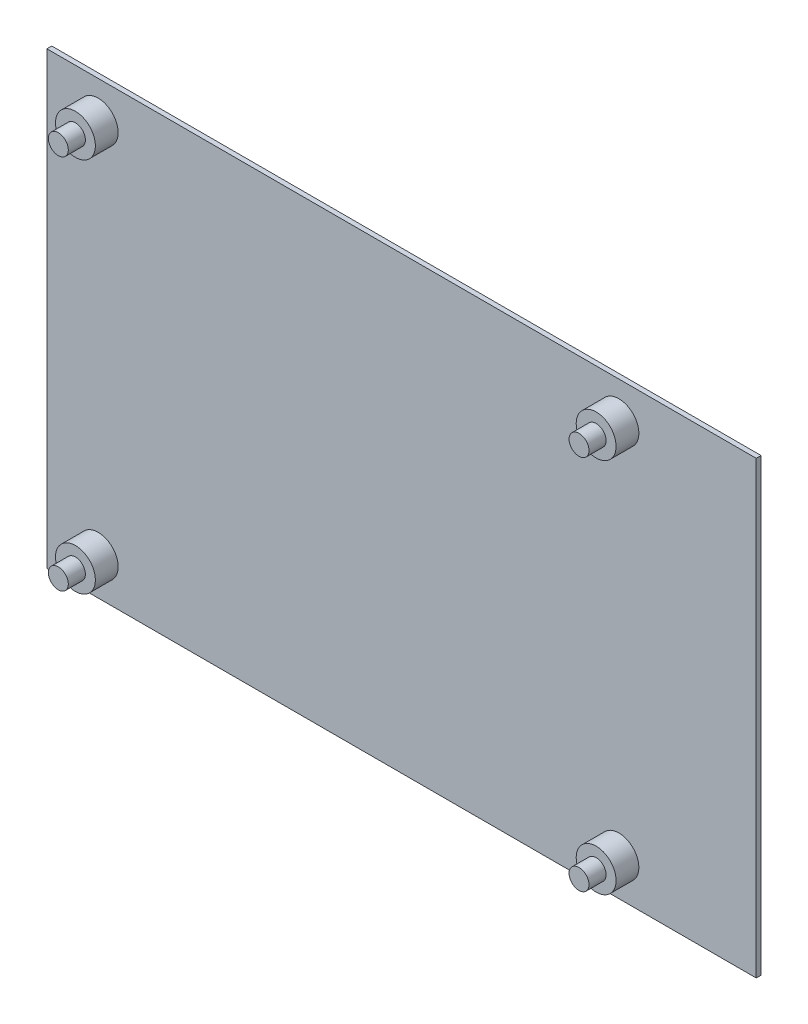
ISO-10303-21;
HEADER;
FILE_DESCRIPTION(('STEP AP214'),'2;1');
FILE_NAME('part.step','',(''),(''),'','','');
FILE_SCHEMA(('AUTOMOTIVE_DESIGN { 1 0 10303 214 1 1 1 1 }'));
ENDSEC;
DATA;
#1=APPLICATION_CONTEXT('core data for automotive mechanical design processes');
#2=APPLICATION_PROTOCOL_DEFINITION('international standard','automotive_design',2000,#1);
#3=PRODUCT_CONTEXT('',#1,'mechanical');
#4=PRODUCT('Part','Part','',(#3));
#5=PRODUCT_RELATED_PRODUCT_CATEGORY('part','',(#4));
#6=PRODUCT_DEFINITION_FORMATION('','',#4);
#7=PRODUCT_DEFINITION_CONTEXT('part definition',#1,'design');
#8=PRODUCT_DEFINITION('design','',#6,#7);
#9=PRODUCT_DEFINITION_SHAPE('','',#8);
#10=(LENGTH_UNIT() NAMED_UNIT(*) SI_UNIT(.MILLI.,.METRE.));
#11=(NAMED_UNIT(*) PLANE_ANGLE_UNIT() SI_UNIT($,.RADIAN.));
#12=(NAMED_UNIT(*) SI_UNIT($,.STERADIAN.) SOLID_ANGLE_UNIT());
#13=UNCERTAINTY_MEASURE_WITH_UNIT(LENGTH_MEASURE(1.E-05),#10,'distance_accuracy_value','');
#14=(GEOMETRIC_REPRESENTATION_CONTEXT(3) GLOBAL_UNCERTAINTY_ASSIGNED_CONTEXT((#13)) GLOBAL_UNIT_ASSIGNED_CONTEXT((#10,
#11,#12)) REPRESENTATION_CONTEXT('',''));
#15=CARTESIAN_POINT('',(0.,0.,0.));
#16=DIRECTION('',(0.,0.,1.));
#17=DIRECTION('',(1.,0.,0.));
#18=AXIS2_PLACEMENT_3D('',#15,#16,#17);
#19=CARTESIAN_POINT('',(-77.2499999999996,22.6999999999998,0.85));
#20=DIRECTION('',(1.,0.,0.));
#21=DIRECTION('',(0.,0.,-1.));
#22=AXIS2_PLACEMENT_3D('',#19,#20,#21);
#23=PLANE('',#22);
#24=DIRECTION('',(0.,-1.,0.));
#25=VECTOR('',#24,1.);
#26=CARTESIAN_POINT('',(-77.2499999999996,22.6999999999998,0.));
#27=LINE('',#26,#25);
#28=CARTESIAN_POINT('',(-77.2499999999996,22.6999999999998,0.));
#29=VERTEX_POINT('',#28);
#30=CARTESIAN_POINT('',(-77.2499999999996,-56.3000000000002,0.));
#31=VERTEX_POINT('',#30);
#32=EDGE_CURVE('E100',#29,#31,#27,.T.);
#33=ORIENTED_EDGE('',*,*,#32,.T.);
#34=DIRECTION('',(0.,0.,-1.));
#35=VECTOR('',#34,1.);
#36=CARTESIAN_POINT('',(-77.2499999999996,-56.3000000000002,0.85));
#37=LINE('',#36,#35);
#38=CARTESIAN_POINT('',(-77.2499999999996,-56.3000000000002,0.85));
#39=VERTEX_POINT('',#38);
#40=EDGE_CURVE('E91',#39,#31,#37,.T.);
#41=ORIENTED_EDGE('',*,*,#40,.F.);
#42=DIRECTION('',(0.,-1.,0.));
#43=VECTOR('',#42,1.);
#44=CARTESIAN_POINT('',(-77.2499999999996,22.6999999999998,0.85));
#45=LINE('',#44,#43);
#46=CARTESIAN_POINT('',(-77.2499999999996,22.6999999999998,0.85));
#47=VERTEX_POINT('',#46);
#48=EDGE_CURVE('E85',#47,#39,#45,.T.);
#49=ORIENTED_EDGE('',*,*,#48,.F.);
#50=DIRECTION('',(0.,0.,-1.));
#51=VECTOR('',#50,1.);
#52=CARTESIAN_POINT('',(-77.2499999999996,22.6999999999998,0.85));
#53=LINE('',#52,#51);
#54=EDGE_CURVE('E96',#47,#29,#53,.T.);
#55=ORIENTED_EDGE('',*,*,#54,.T.);
#56=EDGE_LOOP('',(#33,#41,#49,#55));
#57=FACE_BOUND('',#56,.T.);
#58=ADVANCED_FACE('F33',(#57),#23,.F.);
#59=CARTESIAN_POINT('',(47.2500000000004,-56.3000000000002,0.85));
#60=DIRECTION('',(0.,1.,0.));
#61=DIRECTION('',(-1.,0.,0.));
#62=AXIS2_PLACEMENT_3D('',#59,#60,#61);
#63=PLANE('',#62);
#64=DIRECTION('',(1.,0.,0.));
#65=VECTOR('',#64,1.);
#66=CARTESIAN_POINT('',(47.2500000000004,-56.3000000000002,0.));
#67=LINE('',#66,#65);
#68=CARTESIAN_POINT('',(47.2500000000004,-56.3000000000002,0.));
#69=VERTEX_POINT('',#68);
#70=EDGE_CURVE('E90',#31,#69,#67,.T.);
#71=ORIENTED_EDGE('',*,*,#70,.T.);
#72=DIRECTION('',(0.,0.,-1.));
#73=VECTOR('',#72,1.);
#74=CARTESIAN_POINT('',(47.2500000000004,-56.3000000000002,0.85));
#75=LINE('',#74,#73);
#76=CARTESIAN_POINT('',(47.2500000000004,-56.3000000000002,0.85));
#77=VERTEX_POINT('',#76);
#78=EDGE_CURVE('E88',#77,#69,#75,.T.);
#79=ORIENTED_EDGE('',*,*,#78,.F.);
#80=DIRECTION('',(1.,0.,0.));
#81=VECTOR('',#80,1.);
#82=CARTESIAN_POINT('',(47.2500000000004,-56.3000000000002,0.85));
#83=LINE('',#82,#81);
#84=EDGE_CURVE('E80',#39,#77,#83,.T.);
#85=ORIENTED_EDGE('',*,*,#84,.F.);
#86=ORIENTED_EDGE('',*,*,#40,.T.);
#87=EDGE_LOOP('',(#71,#79,#85,#86));
#88=FACE_BOUND('',#87,.T.);
#89=ADVANCED_FACE('F89',(#88),#63,.F.);
#90=CARTESIAN_POINT('',(47.2500000000005,22.6999999999998,0.85));
#91=DIRECTION('',(-1.,0.,0.));
#92=DIRECTION('',(0.,-1.,0.));
#93=AXIS2_PLACEMENT_3D('',#90,#91,#92);
#94=PLANE('',#93);
#95=DIRECTION('',(0.,1.,0.));
#96=VECTOR('',#95,1.);
#97=CARTESIAN_POINT('',(47.2500000000005,22.6999999999998,0.));
#98=LINE('',#97,#96);
#99=CARTESIAN_POINT('',(47.2500000000005,22.6999999999998,0.));
#100=VERTEX_POINT('',#99);
#101=EDGE_CURVE('E66',#69,#100,#98,.T.);
#102=ORIENTED_EDGE('',*,*,#101,.T.);
#103=DIRECTION('',(0.,0.,-1.));
#104=VECTOR('',#103,1.);
#105=CARTESIAN_POINT('',(47.2500000000005,22.6999999999998,0.85));
#106=LINE('',#105,#104);
#107=CARTESIAN_POINT('',(47.2500000000005,22.6999999999998,0.85));
#108=VERTEX_POINT('',#107);
#109=EDGE_CURVE('E92',#108,#100,#106,.T.);
#110=ORIENTED_EDGE('',*,*,#109,.F.);
#111=DIRECTION('',(0.,1.,0.));
#112=VECTOR('',#111,1.);
#113=CARTESIAN_POINT('',(47.2500000000005,22.6999999999998,0.85));
#114=LINE('',#113,#112);
#115=EDGE_CURVE('E83',#77,#108,#114,.T.);
#116=ORIENTED_EDGE('',*,*,#115,.F.);
#117=ORIENTED_EDGE('',*,*,#78,.T.);
#118=EDGE_LOOP('',(#102,#110,#116,#117));
#119=FACE_BOUND('',#118,.T.);
#120=ADVANCED_FACE('F94',(#119),#94,.F.);
#121=CARTESIAN_POINT('',(47.2500000000005,22.6999999999998,0.85));
#122=DIRECTION('',(0.,-1.,0.));
#123=DIRECTION('',(1.,0.,0.));
#124=AXIS2_PLACEMENT_3D('',#121,#122,#123);
#125=PLANE('',#124);
#126=DIRECTION('',(-1.,0.,0.));
#127=VECTOR('',#126,1.);
#128=CARTESIAN_POINT('',(47.2500000000005,22.6999999999998,0.));
#129=LINE('',#128,#127);
#130=EDGE_CURVE('E72',#100,#29,#129,.T.);
#131=ORIENTED_EDGE('',*,*,#130,.T.);
#132=ORIENTED_EDGE('',*,*,#54,.F.);
#133=DIRECTION('',(-1.,0.,0.));
#134=VECTOR('',#133,1.);
#135=CARTESIAN_POINT('',(47.2500000000005,22.6999999999998,0.85));
#136=LINE('',#135,#134);
#137=EDGE_CURVE('E49',#108,#47,#136,.T.);
#138=ORIENTED_EDGE('',*,*,#137,.F.);
#139=ORIENTED_EDGE('',*,*,#109,.T.);
#140=EDGE_LOOP('',(#131,#132,#138,#139));
#141=FACE_BOUND('',#140,.T.);
#142=ADVANCED_FACE('F123',(#141),#125,.F.);
#143=CARTESIAN_POINT('',(0.,0.,0.85));
#144=DIRECTION('',(0.,0.,-1.));
#145=DIRECTION('',(-1.,0.,0.));
#146=AXIS2_PLACEMENT_3D('',#143,#144,#145);
#147=PLANE('',#146);
#148=CARTESIAN_POINT('',(-68.2499999999996,-49.8000000000002,0.85));
#149=DIRECTION('',(0.,0.,-1.));
#150=DIRECTION('',(-1.,0.,0.));
#151=AXIS2_PLACEMENT_3D('',#148,#149,#150);
#152=CIRCLE('',#151,3.50000000000001);
#153=CARTESIAN_POINT('',(-71.7499999999996,-49.8000000000002,0.85));
#154=VERTEX_POINT('',#153);
#155=EDGE_CURVE('E11',#154,#154,#152,.F.);
#156=ORIENTED_EDGE('',*,*,#155,.F.);
#157=EDGE_LOOP('',(#156));
#158=FACE_BOUND('',#157,.T.);
#159=CARTESIAN_POINT('',(23.1500000000004,-49.8000000000002,0.85));
#160=DIRECTION('',(0.,0.,-1.));
#161=DIRECTION('',(-1.,0.,0.));
#162=AXIS2_PLACEMENT_3D('',#159,#160,#161);
#163=CIRCLE('',#162,3.5);
#164=CARTESIAN_POINT('',(19.6500000000004,-49.8000000000002,0.85));
#165=VERTEX_POINT('',#164);
#166=EDGE_CURVE('E41',#165,#165,#163,.F.);
#167=ORIENTED_EDGE('',*,*,#166,.F.);
#168=EDGE_LOOP('',(#167));
#169=FACE_BOUND('',#168,.T.);
#170=CARTESIAN_POINT('',(23.1500000000004,16.1999999999998,0.85));
#171=DIRECTION('',(0.,0.,-1.));
#172=DIRECTION('',(-1.,0.,0.));
#173=AXIS2_PLACEMENT_3D('',#170,#171,#172);
#174=CIRCLE('',#173,3.5);
#175=CARTESIAN_POINT('',(19.6500000000004,16.1999999999998,0.85));
#176=VERTEX_POINT('',#175);
#177=EDGE_CURVE('E113',#176,#176,#174,.F.);
#178=ORIENTED_EDGE('',*,*,#177,.F.);
#179=EDGE_LOOP('',(#178));
#180=FACE_BOUND('',#179,.T.);
#181=CARTESIAN_POINT('',(-68.2499999999996,16.1999999999998,0.85));
#182=DIRECTION('',(0.,0.,-1.));
#183=DIRECTION('',(-1.,0.,0.));
#184=AXIS2_PLACEMENT_3D('',#181,#182,#183);
#185=CIRCLE('',#184,3.50000000000001);
#186=CARTESIAN_POINT('',(-71.7499999999996,16.1999999999998,0.85));
#187=VERTEX_POINT('',#186);
#188=EDGE_CURVE('E110',#187,#187,#185,.F.);
#189=ORIENTED_EDGE('',*,*,#188,.F.);
#190=EDGE_LOOP('',(#189));
#191=FACE_BOUND('',#190,.T.);
#192=ORIENTED_EDGE('',*,*,#48,.T.);
#193=ORIENTED_EDGE('',*,*,#84,.T.);
#194=ORIENTED_EDGE('',*,*,#115,.T.);
#195=ORIENTED_EDGE('',*,*,#137,.T.);
#196=EDGE_LOOP('',(#192,#193,#194,#195));
#197=FACE_BOUND('',#196,.T.);
#198=ADVANCED_FACE('F81',(#158,#169,#180,#191,#197),#147,.F.);
#199=CARTESIAN_POINT('',(0.,0.,0.));
#200=DIRECTION('',(0.,0.,-1.));
#201=DIRECTION('',(-1.,0.,0.));
#202=AXIS2_PLACEMENT_3D('',#199,#200,#201);
#203=PLANE('',#202);
#204=ORIENTED_EDGE('',*,*,#32,.F.);
#205=ORIENTED_EDGE('',*,*,#130,.F.);
#206=ORIENTED_EDGE('',*,*,#101,.F.);
#207=ORIENTED_EDGE('',*,*,#70,.F.);
#208=EDGE_LOOP('',(#204,#205,#206,#207));
#209=FACE_BOUND('',#208,.T.);
#210=ADVANCED_FACE('F122',(#209),#203,.T.);
#211=CARTESIAN_POINT('',(-68.2499999999996,16.1999999999998,4.85));
#212=DIRECTION('',(0.,0.,-1.));
#213=DIRECTION('',(-1.,0.,0.));
#214=AXIS2_PLACEMENT_3D('',#211,#212,#213);
#215=CYLINDRICAL_SURFACE('',#214,3.50000000000001);
#216=CARTESIAN_POINT('',(-68.2499999999996,16.1999999999998,4.85));
#217=DIRECTION('',(0.,0.,1.));
#218=DIRECTION('',(1.,0.,0.));
#219=AXIS2_PLACEMENT_3D('',#216,#217,#218);
#220=CIRCLE('',#219,3.50000000000001);
#221=CARTESIAN_POINT('',(-64.7499999999996,16.1999999999998,4.85));
#222=VERTEX_POINT('',#221);
#223=EDGE_CURVE('E103',#222,#222,#220,.T.);
#224=ORIENTED_EDGE('',*,*,#223,.F.);
#225=EDGE_LOOP('',(#224));
#226=FACE_BOUND('',#225,.T.);
#227=ORIENTED_EDGE('',*,*,#188,.T.);
#228=EDGE_LOOP('',(#227));
#229=FACE_BOUND('',#228,.T.);
#230=ADVANCED_FACE('F130',(#226,#229),#215,.T.);
#231=CARTESIAN_POINT('',(-68.2499999999996,16.1999999999998,4.85));
#232=DIRECTION('',(0.,0.,1.));
#233=DIRECTION('',(1.,0.,0.));
#234=AXIS2_PLACEMENT_3D('',#231,#232,#233);
#235=PLANE('',#234);
#236=CARTESIAN_POINT('',(-68.2499999999996,16.1999999999998,4.85));
#237=DIRECTION('',(0.,0.,1.));
#238=DIRECTION('',(1.,0.,0.));
#239=AXIS2_PLACEMENT_3D('',#236,#237,#238);
#240=CIRCLE('',#239,1.75);
#241=CARTESIAN_POINT('',(-66.4999999999996,16.1999999999998,4.85));
#242=VERTEX_POINT('',#241);
#243=EDGE_CURVE('E353',#242,#242,#240,.T.);
#244=ORIENTED_EDGE('',*,*,#243,.F.);
#245=EDGE_LOOP('',(#244));
#246=FACE_BOUND('',#245,.T.);
#247=ORIENTED_EDGE('',*,*,#223,.T.);
#248=EDGE_LOOP('',(#247));
#249=FACE_BOUND('',#248,.T.);
#250=ADVANCED_FACE('F132',(#246,#249),#235,.T.);
#251=CARTESIAN_POINT('',(23.1500000000004,16.1999999999998,4.85));
#252=DIRECTION('',(0.,0.,-1.));
#253=DIRECTION('',(-1.,0.,0.));
#254=AXIS2_PLACEMENT_3D('',#251,#252,#253);
#255=CYLINDRICAL_SURFACE('',#254,3.5);
#256=CARTESIAN_POINT('',(23.1500000000004,16.1999999999998,4.85));
#257=DIRECTION('',(0.,0.,1.));
#258=DIRECTION('',(1.,0.,0.));
#259=AXIS2_PLACEMENT_3D('',#256,#257,#258);
#260=CIRCLE('',#259,3.5);
#261=CARTESIAN_POINT('',(26.6500000000004,16.1999999999998,4.85));
#262=VERTEX_POINT('',#261);
#263=EDGE_CURVE('E367',#262,#262,#260,.T.);
#264=ORIENTED_EDGE('',*,*,#263,.F.);
#265=EDGE_LOOP('',(#264));
#266=FACE_BOUND('',#265,.T.);
#267=ORIENTED_EDGE('',*,*,#177,.T.);
#268=EDGE_LOOP('',(#267));
#269=FACE_BOUND('',#268,.T.);
#270=ADVANCED_FACE('F139',(#266,#269),#255,.T.);
#271=CARTESIAN_POINT('',(23.1500000000004,16.1999999999998,4.85));
#272=DIRECTION('',(0.,0.,1.));
#273=DIRECTION('',(1.,0.,0.));
#274=AXIS2_PLACEMENT_3D('',#271,#272,#273);
#275=PLANE('',#274);
#276=CARTESIAN_POINT('',(23.1500000000004,16.1999999999998,4.85));
#277=DIRECTION('',(0.,0.,1.));
#278=DIRECTION('',(1.,0.,0.));
#279=AXIS2_PLACEMENT_3D('',#276,#277,#278);
#280=CIRCLE('',#279,1.75);
#281=CARTESIAN_POINT('',(24.9000000000004,16.1999999999998,4.85));
#282=VERTEX_POINT('',#281);
#283=EDGE_CURVE('E348',#282,#282,#280,.T.);
#284=ORIENTED_EDGE('',*,*,#283,.F.);
#285=EDGE_LOOP('',(#284));
#286=FACE_BOUND('',#285,.T.);
#287=ORIENTED_EDGE('',*,*,#263,.T.);
#288=EDGE_LOOP('',(#287));
#289=FACE_BOUND('',#288,.T.);
#290=ADVANCED_FACE('F204',(#286,#289),#275,.T.);
#291=CARTESIAN_POINT('',(23.1500000000004,-49.8000000000002,4.85));
#292=DIRECTION('',(0.,0.,-1.));
#293=DIRECTION('',(-1.,0.,0.));
#294=AXIS2_PLACEMENT_3D('',#291,#292,#293);
#295=CYLINDRICAL_SURFACE('',#294,3.5);
#296=CARTESIAN_POINT('',(23.1500000000004,-49.8000000000002,4.85));
#297=DIRECTION('',(0.,0.,1.));
#298=DIRECTION('',(1.,0.,0.));
#299=AXIS2_PLACEMENT_3D('',#296,#297,#298);
#300=CIRCLE('',#299,3.5);
#301=CARTESIAN_POINT('',(26.6500000000004,-49.8000000000002,4.85));
#302=VERTEX_POINT('',#301);
#303=EDGE_CURVE('E364',#302,#302,#300,.T.);
#304=ORIENTED_EDGE('',*,*,#303,.F.);
#305=EDGE_LOOP('',(#304));
#306=FACE_BOUND('',#305,.T.);
#307=ORIENTED_EDGE('',*,*,#166,.T.);
#308=EDGE_LOOP('',(#307));
#309=FACE_BOUND('',#308,.T.);
#310=ADVANCED_FACE('F118',(#306,#309),#295,.T.);
#311=CARTESIAN_POINT('',(23.1500000000004,-49.8000000000002,4.85));
#312=DIRECTION('',(0.,0.,1.));
#313=DIRECTION('',(1.,0.,0.));
#314=AXIS2_PLACEMENT_3D('',#311,#312,#313);
#315=PLANE('',#314);
#316=CARTESIAN_POINT('',(23.1500000000004,-49.8000000000002,4.85));
#317=DIRECTION('',(0.,0.,1.));
#318=DIRECTION('',(1.,0.,0.));
#319=AXIS2_PLACEMENT_3D('',#316,#317,#318);
#320=CIRCLE('',#319,1.75);
#321=CARTESIAN_POINT('',(24.9000000000004,-49.8000000000002,4.85));
#322=VERTEX_POINT('',#321);
#323=EDGE_CURVE('E338',#322,#322,#320,.T.);
#324=ORIENTED_EDGE('',*,*,#323,.F.);
#325=EDGE_LOOP('',(#324));
#326=FACE_BOUND('',#325,.T.);
#327=ORIENTED_EDGE('',*,*,#303,.T.);
#328=EDGE_LOOP('',(#327));
#329=FACE_BOUND('',#328,.T.);
#330=ADVANCED_FACE('F221',(#326,#329),#315,.T.);
#331=CARTESIAN_POINT('',(-68.2499999999996,-49.8000000000002,4.85));
#332=DIRECTION('',(0.,0.,-1.));
#333=DIRECTION('',(-1.,0.,0.));
#334=AXIS2_PLACEMENT_3D('',#331,#332,#333);
#335=CYLINDRICAL_SURFACE('',#334,3.50000000000001);
#336=CARTESIAN_POINT('',(-68.2499999999996,-49.8000000000002,4.85));
#337=DIRECTION('',(0.,0.,1.));
#338=DIRECTION('',(1.,0.,0.));
#339=AXIS2_PLACEMENT_3D('',#336,#337,#338);
#340=CIRCLE('',#339,3.50000000000001);
#341=CARTESIAN_POINT('',(-64.7499999999996,-49.8000000000002,4.85));
#342=VERTEX_POINT('',#341);
#343=EDGE_CURVE('E359',#342,#342,#340,.T.);
#344=ORIENTED_EDGE('',*,*,#343,.F.);
#345=EDGE_LOOP('',(#344));
#346=FACE_BOUND('',#345,.T.);
#347=ORIENTED_EDGE('',*,*,#155,.T.);
#348=EDGE_LOOP('',(#347));
#349=FACE_BOUND('',#348,.T.);
#350=ADVANCED_FACE('F229',(#346,#349),#335,.T.);
#351=CARTESIAN_POINT('',(-68.2499999999996,-49.8000000000002,4.85));
#352=DIRECTION('',(0.,0.,1.));
#353=DIRECTION('',(1.,0.,0.));
#354=AXIS2_PLACEMENT_3D('',#351,#352,#353);
#355=PLANE('',#354);
#356=CARTESIAN_POINT('',(-68.2499999999996,-49.8000000000002,4.85));
#357=DIRECTION('',(0.,0.,1.));
#358=DIRECTION('',(1.,0.,0.));
#359=AXIS2_PLACEMENT_3D('',#356,#357,#358);
#360=CIRCLE('',#359,1.75);
#361=CARTESIAN_POINT('',(-66.4999999999996,-49.8000000000002,4.85));
#362=VERTEX_POINT('',#361);
#363=EDGE_CURVE('E339',#362,#362,#360,.T.);
#364=ORIENTED_EDGE('',*,*,#363,.F.);
#365=EDGE_LOOP('',(#364));
#366=FACE_BOUND('',#365,.T.);
#367=ORIENTED_EDGE('',*,*,#343,.T.);
#368=EDGE_LOOP('',(#367));
#369=FACE_BOUND('',#368,.T.);
#370=ADVANCED_FACE('F238',(#366,#369),#355,.T.);
#371=CARTESIAN_POINT('',(-68.2499999999996,16.1999999999998,7.85));
#372=DIRECTION('',(0.,0.,-1.));
#373=DIRECTION('',(-1.,0.,0.));
#374=AXIS2_PLACEMENT_3D('',#371,#372,#373);
#375=CYLINDRICAL_SURFACE('',#374,1.75);
#376=CARTESIAN_POINT('',(-68.2499999999996,16.1999999999998,7.85));
#377=DIRECTION('',(0.,0.,1.));
#378=DIRECTION('',(1.,0.,0.));
#379=AXIS2_PLACEMENT_3D('',#376,#377,#378);
#380=CIRCLE('',#379,1.75);
#381=CARTESIAN_POINT('',(-66.4999999999996,16.1999999999998,7.85));
#382=VERTEX_POINT('',#381);
#383=EDGE_CURVE('E356',#382,#382,#380,.T.);
#384=ORIENTED_EDGE('',*,*,#383,.F.);
#385=EDGE_LOOP('',(#384));
#386=FACE_BOUND('',#385,.T.);
#387=ORIENTED_EDGE('',*,*,#243,.T.);
#388=EDGE_LOOP('',(#387));
#389=FACE_BOUND('',#388,.T.);
#390=ADVANCED_FACE('F246',(#386,#389),#375,.T.);
#391=CARTESIAN_POINT('',(-68.2499999999996,16.1999999999998,7.85));
#392=DIRECTION('',(0.,0.,1.));
#393=DIRECTION('',(1.,0.,0.));
#394=AXIS2_PLACEMENT_3D('',#391,#392,#393);
#395=PLANE('',#394);
#396=ORIENTED_EDGE('',*,*,#383,.T.);
#397=EDGE_LOOP('',(#396));
#398=FACE_BOUND('',#397,.T.);
#399=ADVANCED_FACE('F255',(#398),#395,.T.);
#400=CARTESIAN_POINT('',(23.1500000000004,16.1999999999998,7.85));
#401=DIRECTION('',(0.,0.,-1.));
#402=DIRECTION('',(-1.,0.,0.));
#403=AXIS2_PLACEMENT_3D('',#400,#401,#402);
#404=CYLINDRICAL_SURFACE('',#403,1.75);
#405=CARTESIAN_POINT('',(23.1500000000004,16.1999999999998,7.85));
#406=DIRECTION('',(0.,0.,1.));
#407=DIRECTION('',(1.,0.,0.));
#408=AXIS2_PLACEMENT_3D('',#405,#406,#407);
#409=CIRCLE('',#408,1.75);
#410=CARTESIAN_POINT('',(24.9000000000004,16.1999999999998,7.85));
#411=VERTEX_POINT('',#410);
#412=EDGE_CURVE('E350',#411,#411,#409,.T.);
#413=ORIENTED_EDGE('',*,*,#412,.F.);
#414=EDGE_LOOP('',(#413));
#415=FACE_BOUND('',#414,.T.);
#416=ORIENTED_EDGE('',*,*,#283,.T.);
#417=EDGE_LOOP('',(#416));
#418=FACE_BOUND('',#417,.T.);
#419=ADVANCED_FACE('F264',(#415,#418),#404,.T.);
#420=CARTESIAN_POINT('',(23.1500000000004,16.1999999999998,7.85));
#421=DIRECTION('',(0.,0.,1.));
#422=DIRECTION('',(1.,0.,0.));
#423=AXIS2_PLACEMENT_3D('',#420,#421,#422);
#424=PLANE('',#423);
#425=ORIENTED_EDGE('',*,*,#412,.T.);
#426=EDGE_LOOP('',(#425));
#427=FACE_BOUND('',#426,.T.);
#428=ADVANCED_FACE('F273',(#427),#424,.T.);
#429=CARTESIAN_POINT('',(23.1500000000004,-49.8000000000002,7.85));
#430=DIRECTION('',(0.,0.,-1.));
#431=DIRECTION('',(-1.,0.,0.));
#432=AXIS2_PLACEMENT_3D('',#429,#430,#431);
#433=CYLINDRICAL_SURFACE('',#432,1.75);
#434=CARTESIAN_POINT('',(23.1500000000004,-49.8000000000002,7.85));
#435=DIRECTION('',(0.,0.,1.));
#436=DIRECTION('',(1.,0.,0.));
#437=AXIS2_PLACEMENT_3D('',#434,#435,#436);
#438=CIRCLE('',#437,1.75);
#439=CARTESIAN_POINT('',(24.9000000000004,-49.8000000000002,7.85));
#440=VERTEX_POINT('',#439);
#441=EDGE_CURVE('E342',#440,#440,#438,.T.);
#442=ORIENTED_EDGE('',*,*,#441,.F.);
#443=EDGE_LOOP('',(#442));
#444=FACE_BOUND('',#443,.T.);
#445=ORIENTED_EDGE('',*,*,#323,.T.);
#446=EDGE_LOOP('',(#445));
#447=FACE_BOUND('',#446,.T.);
#448=ADVANCED_FACE('F282',(#444,#447),#433,.T.);
#449=CARTESIAN_POINT('',(23.1500000000004,-49.8000000000002,7.85));
#450=DIRECTION('',(0.,0.,1.));
#451=DIRECTION('',(1.,0.,0.));
#452=AXIS2_PLACEMENT_3D('',#449,#450,#451);
#453=PLANE('',#452);
#454=ORIENTED_EDGE('',*,*,#441,.T.);
#455=EDGE_LOOP('',(#454));
#456=FACE_BOUND('',#455,.T.);
#457=ADVANCED_FACE('F291',(#456),#453,.T.);
#458=CARTESIAN_POINT('',(-68.2499999999996,-49.8000000000002,7.85));
#459=DIRECTION('',(0.,0.,-1.));
#460=DIRECTION('',(-1.,0.,0.));
#461=AXIS2_PLACEMENT_3D('',#458,#459,#460);
#462=CYLINDRICAL_SURFACE('',#461,1.75);
#463=CARTESIAN_POINT('',(-68.2499999999996,-49.8000000000002,7.85));
#464=DIRECTION('',(0.,0.,1.));
#465=DIRECTION('',(1.,0.,0.));
#466=AXIS2_PLACEMENT_3D('',#463,#464,#465);
#467=CIRCLE('',#466,1.75);
#468=CARTESIAN_POINT('',(-66.4999999999996,-49.8000000000002,7.85));
#469=VERTEX_POINT('',#468);
#470=EDGE_CURVE('E337',#469,#469,#467,.T.);
#471=ORIENTED_EDGE('',*,*,#470,.F.);
#472=EDGE_LOOP('',(#471));
#473=FACE_BOUND('',#472,.T.);
#474=ORIENTED_EDGE('',*,*,#363,.T.);
#475=EDGE_LOOP('',(#474));
#476=FACE_BOUND('',#475,.T.);
#477=ADVANCED_FACE('F300',(#473,#476),#462,.T.);
#478=CARTESIAN_POINT('',(-68.2499999999996,-49.8000000000002,7.85));
#479=DIRECTION('',(0.,0.,1.));
#480=DIRECTION('',(1.,0.,0.));
#481=AXIS2_PLACEMENT_3D('',#478,#479,#480);
#482=PLANE('',#481);
#483=ORIENTED_EDGE('',*,*,#470,.T.);
#484=EDGE_LOOP('',(#483));
#485=FACE_BOUND('',#484,.T.);
#486=ADVANCED_FACE('F309',(#485),#482,.T.);
#487=CLOSED_SHELL('',(#58,#89,#120,#142,#198,#210,#230,#250,#270,#290,#310,#330,#350,#370,#390,
#399,#419,#428,#448,#457,#477,#486));
#488=MANIFOLD_SOLID_BREP('B2',#487);
#489=ADVANCED_BREP_SHAPE_REPRESENTATION('',(#18,#488),#14);
#490=SHAPE_DEFINITION_REPRESENTATION(#9,#489);
ENDSEC;
END-ISO-10303-21;
